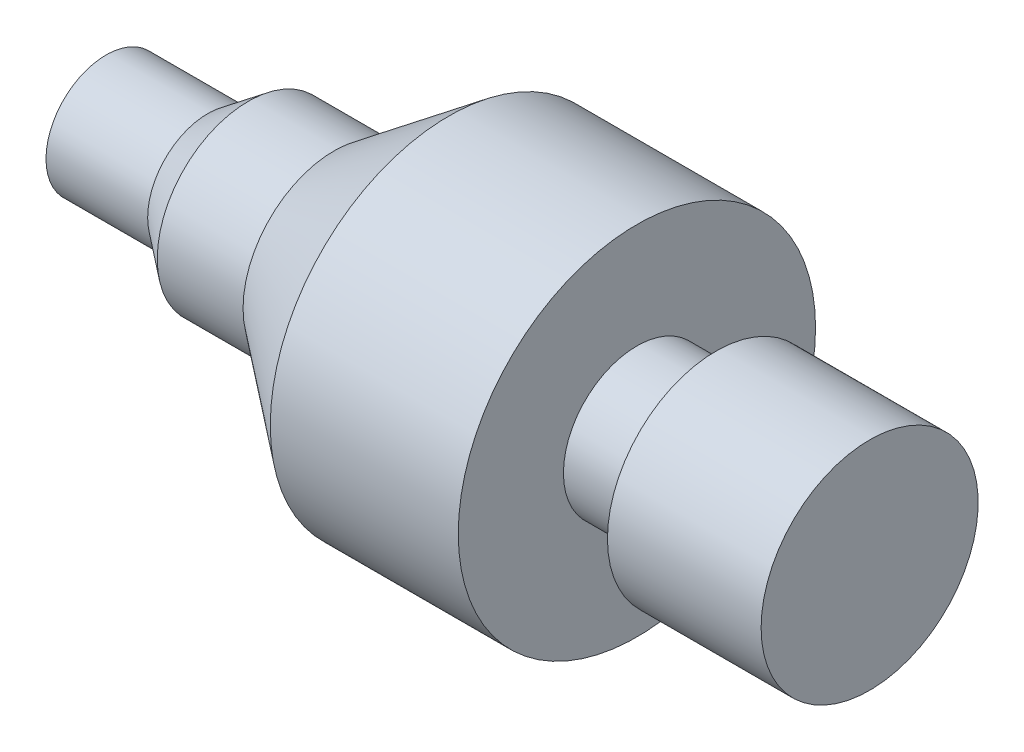
ISO-10303-21;
HEADER;
FILE_DESCRIPTION(('STEP AP214'),'2;1');
FILE_NAME('part.step','',(''),(''),'','','');
FILE_SCHEMA(('AUTOMOTIVE_DESIGN { 1 0 10303 214 1 1 1 1 }'));
ENDSEC;
DATA;
#1=APPLICATION_CONTEXT('core data for automotive mechanical design processes');
#2=APPLICATION_PROTOCOL_DEFINITION('international standard','automotive_design',2000,#1);
#3=PRODUCT_CONTEXT('',#1,'mechanical');
#4=PRODUCT('Part','Part','',(#3));
#5=PRODUCT_RELATED_PRODUCT_CATEGORY('part','',(#4));
#6=PRODUCT_DEFINITION_FORMATION('','',#4);
#7=PRODUCT_DEFINITION_CONTEXT('part definition',#1,'design');
#8=PRODUCT_DEFINITION('design','',#6,#7);
#9=PRODUCT_DEFINITION_SHAPE('','',#8);
#10=(LENGTH_UNIT() NAMED_UNIT(*) SI_UNIT(.MILLI.,.METRE.));
#11=(NAMED_UNIT(*) PLANE_ANGLE_UNIT() SI_UNIT($,.RADIAN.));
#12=(NAMED_UNIT(*) SI_UNIT($,.STERADIAN.) SOLID_ANGLE_UNIT());
#13=UNCERTAINTY_MEASURE_WITH_UNIT(LENGTH_MEASURE(1.E-05),#10,'distance_accuracy_value','');
#14=(GEOMETRIC_REPRESENTATION_CONTEXT(3) GLOBAL_UNCERTAINTY_ASSIGNED_CONTEXT((#13)) GLOBAL_UNIT_ASSIGNED_CONTEXT((#10,
#11,#12)) REPRESENTATION_CONTEXT('',''));
#15=CARTESIAN_POINT('',(0.,0.,0.));
#16=DIRECTION('',(0.,0.,1.));
#17=DIRECTION('',(1.,0.,0.));
#18=AXIS2_PLACEMENT_3D('',#15,#16,#17);
#19=CARTESIAN_POINT('',(68.4973212636461,0.,0.));
#20=DIRECTION('',(-1.,0.,0.));
#21=DIRECTION('',(0.,0.,1.));
#22=AXIS2_PLACEMENT_3D('',#19,#20,#21);
#23=PLANE('',#22);
#24=CARTESIAN_POINT('',(68.4973212636461,0.,0.));
#25=DIRECTION('',(-1.,0.,0.));
#26=DIRECTION('',(0.,0.,1.));
#27=AXIS2_PLACEMENT_3D('',#24,#25,#26);
#28=CIRCLE('',#27,9.73656509021036);
#29=CARTESIAN_POINT('',(68.4973212636461,0.,9.73656509021036));
#30=VERTEX_POINT('',#29);
#31=EDGE_CURVE('E10',#30,#30,#28,.T.);
#32=ORIENTED_EDGE('',*,*,#31,.F.);
#33=EDGE_LOOP('',(#32));
#34=FACE_BOUND('',#33,.T.);
#35=ADVANCED_FACE('F43',(#34),#23,.F.);
#36=CARTESIAN_POINT('',(0.,0.,0.));
#37=DIRECTION('',(-1.,0.,0.));
#38=DIRECTION('',(0.,0.,1.));
#39=AXIS2_PLACEMENT_3D('',#36,#37,#38);
#40=CYLINDRICAL_SURFACE('',#39,9.73656509021036);
#41=CARTESIAN_POINT('',(54.7122187991558,0.,0.));
#42=DIRECTION('',(-1.,0.,0.));
#43=DIRECTION('',(0.,0.,1.));
#44=AXIS2_PLACEMENT_3D('',#41,#42,#43);
#45=CIRCLE('',#44,9.73656509021036);
#46=CARTESIAN_POINT('',(54.7122187991558,0.,9.73656509021036));
#47=VERTEX_POINT('',#46);
#48=EDGE_CURVE('E50',#47,#47,#45,.T.);
#49=ORIENTED_EDGE('',*,*,#48,.F.);
#50=EDGE_LOOP('',(#49));
#51=FACE_BOUND('',#50,.T.);
#52=ORIENTED_EDGE('',*,*,#31,.T.);
#53=EDGE_LOOP('',(#52));
#54=FACE_BOUND('',#53,.T.);
#55=ADVANCED_FACE('F137',(#51,#54),#40,.T.);
#56=CARTESIAN_POINT('',(54.7122187991558,9.73656509021036,0.));
#57=DIRECTION('',(1.,0.,0.));
#58=DIRECTION('',(0.,0.,-1.));
#59=AXIS2_PLACEMENT_3D('',#56,#57,#58);
#60=PLANE('',#59);
#61=CARTESIAN_POINT('',(54.7122187991558,0.,0.));
#62=DIRECTION('',(-1.,0.,0.));
#63=DIRECTION('',(0.,0.,1.));
#64=AXIS2_PLACEMENT_3D('',#61,#62,#63);
#65=CIRCLE('',#64,6.59142035316646);
#66=CARTESIAN_POINT('',(54.7122187991558,0.,6.59142035316646));
#67=VERTEX_POINT('',#66);
#68=EDGE_CURVE('E55',#67,#67,#65,.T.);
#69=ORIENTED_EDGE('',*,*,#68,.F.);
#70=EDGE_LOOP('',(#69));
#71=FACE_BOUND('',#70,.T.);
#72=ORIENTED_EDGE('',*,*,#48,.T.);
#73=EDGE_LOOP('',(#72));
#74=FACE_BOUND('',#73,.T.);
#75=ADVANCED_FACE('F132',(#71,#74),#60,.F.);
#76=CARTESIAN_POINT('',(0.,0.,0.));
#77=DIRECTION('',(-1.,0.,0.));
#78=DIRECTION('',(0.,0.,1.));
#79=AXIS2_PLACEMENT_3D('',#76,#77,#78);
#80=CYLINDRICAL_SURFACE('',#79,6.59142035316646);
#81=CARTESIAN_POINT('',(47.6189136475249,0.,0.));
#82=DIRECTION('',(-1.,0.,0.));
#83=DIRECTION('',(0.,0.,1.));
#84=AXIS2_PLACEMENT_3D('',#81,#82,#83);
#85=CIRCLE('',#84,6.59142035316646);
#86=CARTESIAN_POINT('',(47.6189136475249,0.,6.59142035316646));
#87=VERTEX_POINT('',#86);
#88=EDGE_CURVE('E60',#87,#87,#85,.T.);
#89=ORIENTED_EDGE('',*,*,#88,.F.);
#90=EDGE_LOOP('',(#89));
#91=FACE_BOUND('',#90,.T.);
#92=ORIENTED_EDGE('',*,*,#68,.T.);
#93=EDGE_LOOP('',(#92));
#94=FACE_BOUND('',#93,.T.);
#95=ADVANCED_FACE('F126',(#91,#94),#80,.T.);
#96=CARTESIAN_POINT('',(47.6189136475249,6.59142035316646,0.));
#97=DIRECTION('',(-1.,0.,0.));
#98=DIRECTION('',(0.,0.,1.));
#99=AXIS2_PLACEMENT_3D('',#96,#97,#98);
#100=PLANE('',#99);
#101=CARTESIAN_POINT('',(47.6189136475249,0.,0.));
#102=DIRECTION('',(-1.,0.,0.));
#103=DIRECTION('',(0.,0.,1.));
#104=AXIS2_PLACEMENT_3D('',#101,#102,#103);
#105=CIRCLE('',#104,16.0268545642982);
#106=CARTESIAN_POINT('',(47.6189136475249,0.,16.0268545642982));
#107=VERTEX_POINT('',#106);
#108=EDGE_CURVE('E66',#107,#107,#105,.T.);
#109=ORIENTED_EDGE('',*,*,#108,.F.);
#110=EDGE_LOOP('',(#109));
#111=FACE_BOUND('',#110,.T.);
#112=ORIENTED_EDGE('',*,*,#88,.T.);
#113=EDGE_LOOP('',(#112));
#114=FACE_BOUND('',#113,.T.);
#115=ADVANCED_FACE('F120',(#111,#114),#100,.F.);
#116=CARTESIAN_POINT('',(0.,0.,0.));
#117=DIRECTION('',(-1.,0.,0.));
#118=DIRECTION('',(0.,0.,1.));
#119=AXIS2_PLACEMENT_3D('',#116,#117,#118);
#120=CYLINDRICAL_SURFACE('',#119,16.0268545642982);
#121=CARTESIAN_POINT('',(30.7555844191193,0.,0.));
#122=DIRECTION('',(-1.,0.,0.));
#123=DIRECTION('',(0.,0.,1.));
#124=AXIS2_PLACEMENT_3D('',#121,#122,#123);
#125=CIRCLE('',#124,16.0268545642982);
#126=CARTESIAN_POINT('',(30.7555844191193,0.,16.0268545642982));
#127=VERTEX_POINT('',#126);
#128=EDGE_CURVE('E70',#127,#127,#125,.T.);
#129=ORIENTED_EDGE('',*,*,#128,.F.);
#130=EDGE_LOOP('',(#129));
#131=FACE_BOUND('',#130,.T.);
#132=ORIENTED_EDGE('',*,*,#108,.T.);
#133=EDGE_LOOP('',(#132));
#134=FACE_BOUND('',#133,.T.);
#135=ADVANCED_FACE('F114',(#131,#134),#120,.T.);
#136=CARTESIAN_POINT('',(30.7555844191193,0.,0.));
#137=DIRECTION('',(1.,0.,0.));
#138=DIRECTION('',(0.,0.,-1.));
#139=AXIS2_PLACEMENT_3D('',#136,#137,#138);
#140=CONICAL_SURFACE('',#139,16.0268545642982,0.651761117113924);
#141=CARTESIAN_POINT('',(20.4502165573159,0.,0.));
#142=DIRECTION('',(-1.,0.,0.));
#143=DIRECTION('',(0.,0.,1.));
#144=AXIS2_PLACEMENT_3D('',#141,#142,#143);
#145=CIRCLE('',#144,8.16399272168841);
#146=CARTESIAN_POINT('',(20.4502165573159,0.,8.16399272168841));
#147=VERTEX_POINT('',#146);
#148=EDGE_CURVE('E74',#147,#147,#145,.T.);
#149=ORIENTED_EDGE('',*,*,#148,.F.);
#150=EDGE_LOOP('',(#149));
#151=FACE_BOUND('',#150,.T.);
#152=ORIENTED_EDGE('',*,*,#128,.T.);
#153=EDGE_LOOP('',(#152));
#154=FACE_BOUND('',#153,.T.);
#155=ADVANCED_FACE('F108',(#151,#154),#140,.T.);
#156=CARTESIAN_POINT('',(0.,0.,0.));
#157=DIRECTION('',(-1.,0.,0.));
#158=DIRECTION('',(0.,0.,1.));
#159=AXIS2_PLACEMENT_3D('',#156,#157,#158);
#160=CYLINDRICAL_SURFACE('',#159,8.16399272168841);
#161=CARTESIAN_POINT('',(12.7546496475276,0.,0.));
#162=DIRECTION('',(-1.,0.,0.));
#163=DIRECTION('',(0.,0.,1.));
#164=AXIS2_PLACEMENT_3D('',#161,#162,#163);
#165=CIRCLE('',#164,8.16399272168841);
#166=CARTESIAN_POINT('',(12.7546496475276,0.,8.16399272168841));
#167=VERTEX_POINT('',#166);
#168=EDGE_CURVE('E78',#167,#167,#165,.T.);
#169=ORIENTED_EDGE('',*,*,#168,.F.);
#170=EDGE_LOOP('',(#169));
#171=FACE_BOUND('',#170,.T.);
#172=ORIENTED_EDGE('',*,*,#148,.T.);
#173=EDGE_LOOP('',(#172));
#174=FACE_BOUND('',#173,.T.);
#175=ADVANCED_FACE('F102',(#171,#174),#160,.T.);
#176=CARTESIAN_POINT('',(12.7546496475276,0.,0.));
#177=DIRECTION('',(1.,0.,0.));
#178=DIRECTION('',(0.,0.,-1.));
#179=AXIS2_PLACEMENT_3D('',#176,#177,#178);
#180=CONICAL_SURFACE('',#179,8.16399272168841,0.651761117113925);
#181=CARTESIAN_POINT('',(9.1192179224918,0.,0.));
#182=DIRECTION('',(-1.,0.,0.));
#183=DIRECTION('',(0.,0.,1.));
#184=AXIS2_PLACEMENT_3D('',#181,#182,#183);
#185=CIRCLE('',#184,5.39020552888508);
#186=CARTESIAN_POINT('',(9.1192179224918,0.,5.39020552888508));
#187=VERTEX_POINT('',#186);
#188=EDGE_CURVE('E82',#187,#187,#185,.T.);
#189=ORIENTED_EDGE('',*,*,#188,.F.);
#190=EDGE_LOOP('',(#189));
#191=FACE_BOUND('',#190,.T.);
#192=ORIENTED_EDGE('',*,*,#168,.T.);
#193=EDGE_LOOP('',(#192));
#194=FACE_BOUND('',#193,.T.);
#195=ADVANCED_FACE('F96',(#191,#194),#180,.T.);
#196=CARTESIAN_POINT('',(0.,0.,0.));
#197=DIRECTION('',(-1.,0.,0.));
#198=DIRECTION('',(0.,0.,1.));
#199=AXIS2_PLACEMENT_3D('',#196,#197,#198);
#200=CYLINDRICAL_SURFACE('',#199,5.39020552888508);
#201=CARTESIAN_POINT('',(0.,0.,0.));
#202=DIRECTION('',(-1.,0.,0.));
#203=DIRECTION('',(0.,0.,1.));
#204=AXIS2_PLACEMENT_3D('',#201,#202,#203);
#205=CIRCLE('',#204,5.39020552888508);
#206=CARTESIAN_POINT('',(0.,0.,5.39020552888508));
#207=VERTEX_POINT('',#206);
#208=EDGE_CURVE('E86',#207,#207,#205,.T.);
#209=ORIENTED_EDGE('',*,*,#208,.F.);
#210=EDGE_LOOP('',(#209));
#211=FACE_BOUND('',#210,.T.);
#212=ORIENTED_EDGE('',*,*,#188,.T.);
#213=EDGE_LOOP('',(#212));
#214=FACE_BOUND('',#213,.T.);
#215=ADVANCED_FACE('F93',(#211,#214),#200,.T.);
#216=CARTESIAN_POINT('',(0.,5.39020552888508,0.));
#217=DIRECTION('',(1.,0.,0.));
#218=DIRECTION('',(0.,0.,-1.));
#219=AXIS2_PLACEMENT_3D('',#216,#217,#218);
#220=PLANE('',#219);
#221=ORIENTED_EDGE('',*,*,#208,.T.);
#222=EDGE_LOOP('',(#221));
#223=FACE_BOUND('',#222,.T.);
#224=ADVANCED_FACE('F91',(#223),#220,.F.);
#225=CLOSED_SHELL('',(#35,#55,#75,#95,#115,#135,#155,#175,#195,#215,#224));
#226=MANIFOLD_SOLID_BREP('B2',#225);
#227=ADVANCED_BREP_SHAPE_REPRESENTATION('',(#18,#226),#14);
#228=SHAPE_DEFINITION_REPRESENTATION(#9,#227);
ENDSEC;
END-ISO-10303-21;
